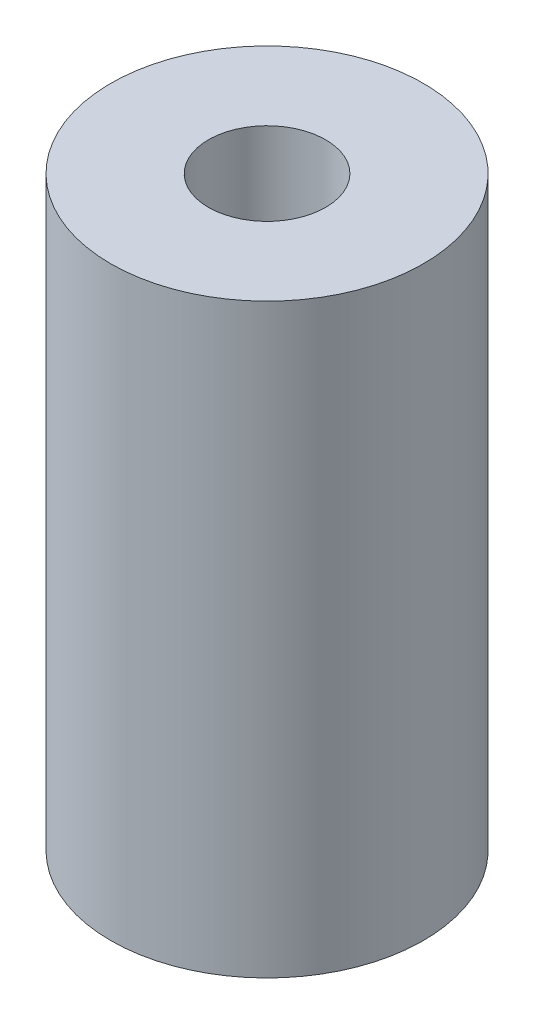
ISO-10303-21;
HEADER;
FILE_DESCRIPTION(('STEP AP214'),'2;1');
FILE_NAME('part.step','',(''),(''),'','','');
FILE_SCHEMA(('AUTOMOTIVE_DESIGN { 1 0 10303 214 1 1 1 1 }'));
ENDSEC;
DATA;
#1=APPLICATION_CONTEXT('core data for automotive mechanical design processes');
#2=APPLICATION_PROTOCOL_DEFINITION('international standard','automotive_design',2000,#1);
#3=PRODUCT_CONTEXT('',#1,'mechanical');
#4=PRODUCT('Part','Part','',(#3));
#5=PRODUCT_RELATED_PRODUCT_CATEGORY('part','',(#4));
#6=PRODUCT_DEFINITION_FORMATION('','',#4);
#7=PRODUCT_DEFINITION_CONTEXT('part definition',#1,'design');
#8=PRODUCT_DEFINITION('design','',#6,#7);
#9=PRODUCT_DEFINITION_SHAPE('','',#8);
#10=(LENGTH_UNIT() NAMED_UNIT(*) SI_UNIT(.MILLI.,.METRE.));
#11=(NAMED_UNIT(*) PLANE_ANGLE_UNIT() SI_UNIT($,.RADIAN.));
#12=(NAMED_UNIT(*) SI_UNIT($,.STERADIAN.) SOLID_ANGLE_UNIT());
#13=UNCERTAINTY_MEASURE_WITH_UNIT(LENGTH_MEASURE(1.E-05),#10,'distance_accuracy_value','');
#14=(GEOMETRIC_REPRESENTATION_CONTEXT(3) GLOBAL_UNCERTAINTY_ASSIGNED_CONTEXT((#13)) GLOBAL_UNIT_ASSIGNED_CONTEXT((#10,
#11,#12)) REPRESENTATION_CONTEXT('',''));
#15=CARTESIAN_POINT('',(0.,0.,0.));
#16=DIRECTION('',(0.,0.,1.));
#17=DIRECTION('',(1.,0.,0.));
#18=AXIS2_PLACEMENT_3D('',#15,#16,#17);
#19=CARTESIAN_POINT('',(0.,15.,0.));
#20=DIRECTION('',(0.,-1.,0.));
#21=DIRECTION('',(0.,0.,-1.));
#22=AXIS2_PLACEMENT_3D('',#19,#20,#21);
#23=CYLINDRICAL_SURFACE('',#22,4.);
#24=CARTESIAN_POINT('',(0.,15.,0.));
#25=DIRECTION('',(0.,1.,0.));
#26=DIRECTION('',(0.,0.,1.));
#27=AXIS2_PLACEMENT_3D('',#24,#25,#26);
#28=CIRCLE('',#27,4.);
#29=CARTESIAN_POINT('',(0.,15.,4.));
#30=VERTEX_POINT('',#29);
#31=EDGE_CURVE('E10',#30,#30,#28,.T.);
#32=ORIENTED_EDGE('',*,*,#31,.F.);
#33=EDGE_LOOP('',(#32));
#34=FACE_BOUND('',#33,.T.);
#35=CARTESIAN_POINT('',(0.,0.,0.));
#36=DIRECTION('',(0.,1.,0.));
#37=DIRECTION('',(0.,0.,1.));
#38=AXIS2_PLACEMENT_3D('',#35,#36,#37);
#39=CIRCLE('',#38,4.);
#40=CARTESIAN_POINT('',(0.,0.,4.));
#41=VERTEX_POINT('',#40);
#42=EDGE_CURVE('E40',#41,#41,#39,.T.);
#43=ORIENTED_EDGE('',*,*,#42,.T.);
#44=EDGE_LOOP('',(#43));
#45=FACE_BOUND('',#44,.T.);
#46=ADVANCED_FACE('F37',(#34,#45),#23,.T.);
#47=CARTESIAN_POINT('',(0.,15.,0.));
#48=DIRECTION('',(0.,1.,0.));
#49=DIRECTION('',(0.,0.,1.));
#50=AXIS2_PLACEMENT_3D('',#47,#48,#49);
#51=PLANE('',#50);
#52=CARTESIAN_POINT('',(0.,15.,0.));
#53=DIRECTION('',(0.,1.,0.));
#54=DIRECTION('',(0.,0.,1.));
#55=AXIS2_PLACEMENT_3D('',#52,#53,#54);
#56=CIRCLE('',#55,1.5);
#57=CARTESIAN_POINT('',(0.,15.,1.5));
#58=VERTEX_POINT('',#57);
#59=EDGE_CURVE('E51',#58,#58,#56,.T.);
#60=ORIENTED_EDGE('',*,*,#59,.F.);
#61=EDGE_LOOP('',(#60));
#62=FACE_BOUND('',#61,.T.);
#63=ORIENTED_EDGE('',*,*,#31,.T.);
#64=EDGE_LOOP('',(#63));
#65=FACE_BOUND('',#64,.T.);
#66=ADVANCED_FACE('F68',(#62,#65),#51,.T.);
#67=CARTESIAN_POINT('',(0.,0.,0.));
#68=DIRECTION('',(0.,1.,0.));
#69=DIRECTION('',(0.,0.,1.));
#70=AXIS2_PLACEMENT_3D('',#67,#68,#69);
#71=PLANE('',#70);
#72=CARTESIAN_POINT('',(0.,0.,0.));
#73=DIRECTION('',(0.,1.,0.));
#74=DIRECTION('',(0.,0.,1.));
#75=AXIS2_PLACEMENT_3D('',#72,#73,#74);
#76=CIRCLE('',#75,1.5);
#77=CARTESIAN_POINT('',(0.,0.,1.5));
#78=VERTEX_POINT('',#77);
#79=EDGE_CURVE('E49',#78,#78,#76,.T.);
#80=ORIENTED_EDGE('',*,*,#79,.T.);
#81=EDGE_LOOP('',(#80));
#82=FACE_BOUND('',#81,.T.);
#83=ORIENTED_EDGE('',*,*,#42,.F.);
#84=EDGE_LOOP('',(#83));
#85=FACE_BOUND('',#84,.T.);
#86=ADVANCED_FACE('F59',(#82,#85),#71,.F.);
#87=CARTESIAN_POINT('',(0.,0.,0.));
#88=DIRECTION('',(0.,1.,0.));
#89=DIRECTION('',(0.,0.,1.));
#90=AXIS2_PLACEMENT_3D('',#87,#88,#89);
#91=CYLINDRICAL_SURFACE('',#90,1.5);
#92=ORIENTED_EDGE('',*,*,#79,.F.);
#93=EDGE_LOOP('',(#92));
#94=FACE_BOUND('',#93,.T.);
#95=ORIENTED_EDGE('',*,*,#59,.T.);
#96=EDGE_LOOP('',(#95));
#97=FACE_BOUND('',#96,.T.);
#98=ADVANCED_FACE('F62',(#94,#97),#91,.F.);
#99=CLOSED_SHELL('',(#46,#66,#86,#98));
#100=MANIFOLD_SOLID_BREP('B2',#99);
#101=ADVANCED_BREP_SHAPE_REPRESENTATION('',(#18,#100),#14);
#102=SHAPE_DEFINITION_REPRESENTATION(#9,#101);
ENDSEC;
END-ISO-10303-21;
